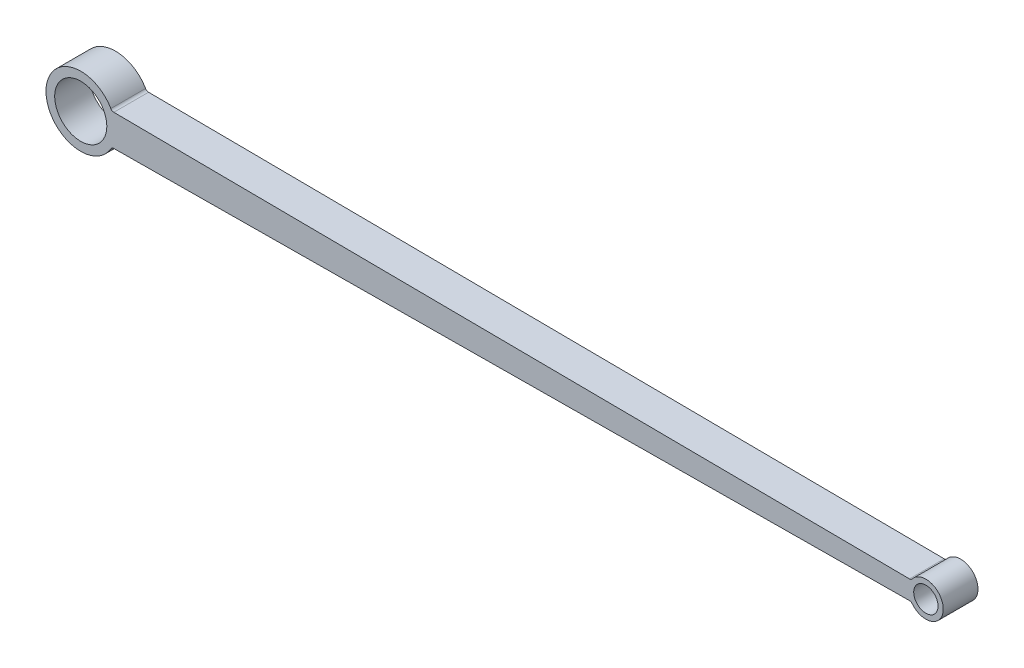
ISO-10303-21;
HEADER;
FILE_DESCRIPTION(('STEP AP214'),'2;1');
FILE_NAME('part.step','',(''),(''),'','','');
FILE_SCHEMA(('AUTOMOTIVE_DESIGN { 1 0 10303 214 1 1 1 1 }'));
ENDSEC;
DATA;
#1=APPLICATION_CONTEXT('core data for automotive mechanical design processes');
#2=APPLICATION_PROTOCOL_DEFINITION('international standard','automotive_design',2000,#1);
#3=PRODUCT_CONTEXT('',#1,'mechanical');
#4=PRODUCT('Part','Part','',(#3));
#5=PRODUCT_RELATED_PRODUCT_CATEGORY('part','',(#4));
#6=PRODUCT_DEFINITION_FORMATION('','',#4);
#7=PRODUCT_DEFINITION_CONTEXT('part definition',#1,'design');
#8=PRODUCT_DEFINITION('design','',#6,#7);
#9=PRODUCT_DEFINITION_SHAPE('','',#8);
#10=(LENGTH_UNIT() NAMED_UNIT(*) SI_UNIT(.MILLI.,.METRE.));
#11=(NAMED_UNIT(*) PLANE_ANGLE_UNIT() SI_UNIT($,.RADIAN.));
#12=(NAMED_UNIT(*) SI_UNIT($,.STERADIAN.) SOLID_ANGLE_UNIT());
#13=UNCERTAINTY_MEASURE_WITH_UNIT(LENGTH_MEASURE(1.E-05),#10,'distance_accuracy_value','');
#14=(GEOMETRIC_REPRESENTATION_CONTEXT(3) GLOBAL_UNCERTAINTY_ASSIGNED_CONTEXT((#13)) GLOBAL_UNIT_ASSIGNED_CONTEXT((#10,
#11,#12)) REPRESENTATION_CONTEXT('',''));
#15=CARTESIAN_POINT('',(0.,0.,0.));
#16=DIRECTION('',(0.,0.,1.));
#17=DIRECTION('',(1.,0.,0.));
#18=AXIS2_PLACEMENT_3D('',#15,#16,#17);
#19=CARTESIAN_POINT('',(238.480970882939,3.70550457999018,10.));
#20=DIRECTION('',(0.,0.,1.));
#21=DIRECTION('',(1.,0.,0.));
#22=AXIS2_PLACEMENT_3D('',#19,#20,#21);
#23=PLANE('',#22);
#24=CARTESIAN_POINT('',(0.,0.,10.));
#25=DIRECTION('',(0.,0.,1.));
#26=DIRECTION('',(1.,0.,0.));
#27=AXIS2_PLACEMENT_3D('',#24,#25,#26);
#28=CIRCLE('',#27,7.5);
#29=CARTESIAN_POINT('',(7.5,0.,10.));
#30=VERTEX_POINT('',#29);
#31=EDGE_CURVE('E133',#30,#30,#28,.T.);
#32=ORIENTED_EDGE('',*,*,#31,.F.);
#33=EDGE_LOOP('',(#32));
#34=FACE_BOUND('',#33,.T.);
#35=CARTESIAN_POINT('',(238.480970882939,3.70550457999018,10.));
#36=DIRECTION('',(0.,0.,-1.));
#37=DIRECTION('',(1.,0.,0.));
#38=AXIS2_PLACEMENT_3D('',#35,#36,#37);
#39=CIRCLE('',#38,0.999999999999998);
#40=CARTESIAN_POINT('',(239.267475735782,3.08792048332516,10.));
#41=VERTEX_POINT('',#40);
#42=CARTESIAN_POINT('',(238.473101756803,2.70553554204258,10.));
#43=VERTEX_POINT('',#42);
#44=EDGE_CURVE('E144',#41,#43,#39,.T.);
#45=ORIENTED_EDGE('',*,*,#44,.T.);
#46=DIRECTION('',(-0.999969037947602,0.00786912613617369,0.));
#47=VECTOR('',#46,1.);
#48=CARTESIAN_POINT('',(9.51421115466079,4.50729771844414,10.));
#49=LINE('',#48,#47);
#50=CARTESIAN_POINT('',(9.51421115466079,4.50729771844414,10.));
#51=VERTEX_POINT('',#50);
#52=EDGE_CURVE('E92',#43,#51,#49,.T.);
#53=ORIENTED_EDGE('',*,*,#52,.T.);
#54=CARTESIAN_POINT('',(9.52208028079696,5.50726675639174,10.));
#55=DIRECTION('',(0.,0.,-1.));
#56=DIRECTION('',(-1.,0.,0.));
#57=AXIS2_PLACEMENT_3D('',#54,#55,#56);
#58=CIRCLE('',#57,0.999999999999999);
#59=CARTESIAN_POINT('',(8.65643661890633,5.00660614217431,10.));
#60=VERTEX_POINT('',#59);
#61=EDGE_CURVE('E159',#51,#60,#58,.T.);
#62=ORIENTED_EDGE('',*,*,#61,.T.);
#63=CARTESIAN_POINT('',(0.,0.,10.));
#64=DIRECTION('',(0.,0.,1.));
#65=DIRECTION('',(1.,0.,0.));
#66=AXIS2_PLACEMENT_3D('',#63,#64,#65);
#67=CIRCLE('',#66,10.);
#68=CARTESIAN_POINT('',(8.65643661890633,-5.00660614217431,10.));
#69=VERTEX_POINT('',#68);
#70=EDGE_CURVE('E172',#60,#69,#67,.T.);
#71=ORIENTED_EDGE('',*,*,#70,.T.);
#72=CARTESIAN_POINT('',(9.52208028079696,-5.50726675639174,10.));
#73=DIRECTION('',(0.,0.,-1.));
#74=DIRECTION('',(1.,0.,0.));
#75=AXIS2_PLACEMENT_3D('',#72,#73,#74);
#76=CIRCLE('',#75,0.999999999999999);
#77=CARTESIAN_POINT('',(9.51421115466079,-4.50729771844414,10.));
#78=VERTEX_POINT('',#77);
#79=EDGE_CURVE('E111',#69,#78,#76,.T.);
#80=ORIENTED_EDGE('',*,*,#79,.T.);
#81=DIRECTION('',(0.999969037947602,0.00786912613617369,0.));
#82=VECTOR('',#81,1.);
#83=CARTESIAN_POINT('',(9.51421115466079,-4.50729771844414,10.));
#84=LINE('',#83,#82);
#85=CARTESIAN_POINT('',(238.473101756803,-2.70553554204258,10.));
#86=VERTEX_POINT('',#85);
#87=EDGE_CURVE('E105',#78,#86,#84,.T.);
#88=ORIENTED_EDGE('',*,*,#87,.T.);
#89=CARTESIAN_POINT('',(238.480970882939,-3.70550457999018,10.));
#90=DIRECTION('',(0.,0.,-1.));
#91=DIRECTION('',(-1.,0.,0.));
#92=AXIS2_PLACEMENT_3D('',#89,#90,#91);
#93=CIRCLE('',#92,0.999999999999998);
#94=CARTESIAN_POINT('',(239.267475735782,-3.08792048332516,10.));
#95=VERTEX_POINT('',#94);
#96=EDGE_CURVE('E109',#86,#95,#93,.T.);
#97=ORIENTED_EDGE('',*,*,#96,.T.);
#98=CARTESIAN_POINT('',(243.2,0.,10.));
#99=DIRECTION('',(0.,0.,1.));
#100=DIRECTION('',(1.,0.,0.));
#101=AXIS2_PLACEMENT_3D('',#98,#99,#100);
#102=CIRCLE('',#101,5.00000000000002);
#103=EDGE_CURVE('E49',#95,#41,#102,.T.);
#104=ORIENTED_EDGE('',*,*,#103,.T.);
#105=EDGE_LOOP('',(#45,#53,#62,#71,#80,#88,#97,#104));
#106=FACE_BOUND('',#105,.T.);
#107=CARTESIAN_POINT('',(243.2,0.,10.));
#108=DIRECTION('',(0.,0.,1.));
#109=DIRECTION('',(1.,0.,0.));
#110=AXIS2_PLACEMENT_3D('',#107,#108,#109);
#111=CIRCLE('',#110,3.49999999999999);
#112=CARTESIAN_POINT('',(246.7,0.,10.));
#113=VERTEX_POINT('',#112);
#114=EDGE_CURVE('E181',#113,#113,#111,.T.);
#115=ORIENTED_EDGE('',*,*,#114,.F.);
#116=EDGE_LOOP('',(#115));
#117=FACE_BOUND('',#116,.T.);
#118=ADVANCED_FACE('F32',(#34,#106,#117),#23,.T.);
#119=CARTESIAN_POINT('',(238.480970882939,3.70550457999018,0.));
#120=DIRECTION('',(0.,0.,1.));
#121=DIRECTION('',(1.,0.,0.));
#122=AXIS2_PLACEMENT_3D('',#119,#120,#121);
#123=PLANE('',#122);
#124=CARTESIAN_POINT('',(238.480970882939,3.70550457999018,0.));
#125=DIRECTION('',(0.,0.,-1.));
#126=DIRECTION('',(1.,0.,0.));
#127=AXIS2_PLACEMENT_3D('',#124,#125,#126);
#128=CIRCLE('',#127,0.999999999999998);
#129=CARTESIAN_POINT('',(239.267475735782,3.08792048332516,0.));
#130=VERTEX_POINT('',#129);
#131=CARTESIAN_POINT('',(238.473101756803,2.70553554204258,0.));
#132=VERTEX_POINT('',#131);
#133=EDGE_CURVE('E129',#130,#132,#128,.T.);
#134=ORIENTED_EDGE('',*,*,#133,.F.);
#135=CARTESIAN_POINT('',(243.2,0.,0.));
#136=DIRECTION('',(0.,0.,1.));
#137=DIRECTION('',(1.,0.,0.));
#138=AXIS2_PLACEMENT_3D('',#135,#136,#137);
#139=CIRCLE('',#138,5.00000000000002);
#140=CARTESIAN_POINT('',(239.267475735782,-3.08792048332516,0.));
#141=VERTEX_POINT('',#140);
#142=EDGE_CURVE('E84',#141,#130,#139,.T.);
#143=ORIENTED_EDGE('',*,*,#142,.F.);
#144=CARTESIAN_POINT('',(238.480970882939,-3.70550457999018,0.));
#145=DIRECTION('',(0.,0.,-1.));
#146=DIRECTION('',(-1.,0.,0.));
#147=AXIS2_PLACEMENT_3D('',#144,#145,#146);
#148=CIRCLE('',#147,0.999999999999998);
#149=CARTESIAN_POINT('',(238.473101756803,-2.70553554204258,0.));
#150=VERTEX_POINT('',#149);
#151=EDGE_CURVE('E78',#150,#141,#148,.T.);
#152=ORIENTED_EDGE('',*,*,#151,.F.);
#153=DIRECTION('',(0.999969037947602,0.00786912613617369,0.));
#154=VECTOR('',#153,1.);
#155=CARTESIAN_POINT('',(9.51421115466079,-4.50729771844414,0.));
#156=LINE('',#155,#154);
#157=CARTESIAN_POINT('',(9.51421115466079,-4.50729771844414,0.));
#158=VERTEX_POINT('',#157);
#159=EDGE_CURVE('E119',#158,#150,#156,.T.);
#160=ORIENTED_EDGE('',*,*,#159,.F.);
#161=CARTESIAN_POINT('',(9.52208028079696,-5.50726675639174,0.));
#162=DIRECTION('',(0.,0.,-1.));
#163=DIRECTION('',(1.,0.,0.));
#164=AXIS2_PLACEMENT_3D('',#161,#162,#163);
#165=CIRCLE('',#164,0.999999999999999);
#166=CARTESIAN_POINT('',(8.65643661890633,-5.00660614217431,0.));
#167=VERTEX_POINT('',#166);
#168=EDGE_CURVE('E139',#167,#158,#165,.T.);
#169=ORIENTED_EDGE('',*,*,#168,.F.);
#170=CARTESIAN_POINT('',(0.,0.,0.));
#171=DIRECTION('',(0.,0.,1.));
#172=DIRECTION('',(1.,0.,0.));
#173=AXIS2_PLACEMENT_3D('',#170,#171,#172);
#174=CIRCLE('',#173,10.);
#175=CARTESIAN_POINT('',(8.65643661890633,5.00660614217431,0.));
#176=VERTEX_POINT('',#175);
#177=EDGE_CURVE('E137',#176,#167,#174,.T.);
#178=ORIENTED_EDGE('',*,*,#177,.F.);
#179=CARTESIAN_POINT('',(9.52208028079696,5.50726675639174,0.));
#180=DIRECTION('',(0.,0.,-1.));
#181=DIRECTION('',(-1.,0.,0.));
#182=AXIS2_PLACEMENT_3D('',#179,#180,#181);
#183=CIRCLE('',#182,0.999999999999999);
#184=CARTESIAN_POINT('',(9.51421115466079,4.50729771844414,0.));
#185=VERTEX_POINT('',#184);
#186=EDGE_CURVE('E135',#185,#176,#183,.T.);
#187=ORIENTED_EDGE('',*,*,#186,.F.);
#188=DIRECTION('',(-0.999969037947602,0.00786912613617369,0.));
#189=VECTOR('',#188,1.);
#190=CARTESIAN_POINT('',(9.51421115466079,4.50729771844414,0.));
#191=LINE('',#190,#189);
#192=EDGE_CURVE('E132',#132,#185,#191,.T.);
#193=ORIENTED_EDGE('',*,*,#192,.F.);
#194=EDGE_LOOP('',(#134,#143,#152,#160,#169,#178,#187,#193));
#195=FACE_BOUND('',#194,.T.);
#196=CARTESIAN_POINT('',(0.,0.,0.));
#197=DIRECTION('',(0.,0.,1.));
#198=DIRECTION('',(1.,0.,0.));
#199=AXIS2_PLACEMENT_3D('',#196,#197,#198);
#200=CIRCLE('',#199,7.5);
#201=CARTESIAN_POINT('',(7.5,0.,0.));
#202=VERTEX_POINT('',#201);
#203=EDGE_CURVE('E178',#202,#202,#200,.T.);
#204=ORIENTED_EDGE('',*,*,#203,.T.);
#205=EDGE_LOOP('',(#204));
#206=FACE_BOUND('',#205,.T.);
#207=CARTESIAN_POINT('',(243.2,0.,0.));
#208=DIRECTION('',(0.,0.,1.));
#209=DIRECTION('',(1.,0.,0.));
#210=AXIS2_PLACEMENT_3D('',#207,#208,#209);
#211=CIRCLE('',#210,3.49999999999999);
#212=CARTESIAN_POINT('',(246.7,0.,0.));
#213=VERTEX_POINT('',#212);
#214=EDGE_CURVE('E184',#213,#213,#211,.T.);
#215=ORIENTED_EDGE('',*,*,#214,.T.);
#216=EDGE_LOOP('',(#215));
#217=FACE_BOUND('',#216,.T.);
#218=ADVANCED_FACE('F163',(#195,#206,#217),#123,.F.);
#219=CARTESIAN_POINT('',(238.480970882939,3.70550457999018,10.));
#220=DIRECTION('',(0.,0.,-1.));
#221=DIRECTION('',(-1.,0.,0.));
#222=AXIS2_PLACEMENT_3D('',#219,#220,#221);
#223=CYLINDRICAL_SURFACE('',#222,0.999999999999998);
#224=ORIENTED_EDGE('',*,*,#133,.T.);
#225=DIRECTION('',(0.,0.,-1.));
#226=VECTOR('',#225,1.);
#227=CARTESIAN_POINT('',(238.473101756803,2.70553554204258,10.));
#228=LINE('',#227,#226);
#229=EDGE_CURVE('E11',#43,#132,#228,.T.);
#230=ORIENTED_EDGE('',*,*,#229,.F.);
#231=ORIENTED_EDGE('',*,*,#44,.F.);
#232=DIRECTION('',(0.,0.,-1.));
#233=VECTOR('',#232,1.);
#234=CARTESIAN_POINT('',(239.267475735782,3.08792048332516,10.));
#235=LINE('',#234,#233);
#236=EDGE_CURVE('E125',#41,#130,#235,.T.);
#237=ORIENTED_EDGE('',*,*,#236,.T.);
#238=EDGE_LOOP('',(#224,#230,#231,#237));
#239=FACE_BOUND('',#238,.T.);
#240=ADVANCED_FACE('F34',(#239),#223,.F.);
#241=CARTESIAN_POINT('',(9.51421115466079,4.50729771844414,10.));
#242=DIRECTION('',(-0.00786912613617369,-0.999969037947602,0.));
#243=DIRECTION('',(0.999969037947602,-0.00786912613617369,0.));
#244=AXIS2_PLACEMENT_3D('',#241,#242,#243);
#245=PLANE('',#244);
#246=ORIENTED_EDGE('',*,*,#192,.T.);
#247=DIRECTION('',(0.,0.,-1.));
#248=VECTOR('',#247,1.);
#249=CARTESIAN_POINT('',(9.51421115466079,4.50729771844414,10.));
#250=LINE('',#249,#248);
#251=EDGE_CURVE('E41',#51,#185,#250,.T.);
#252=ORIENTED_EDGE('',*,*,#251,.F.);
#253=ORIENTED_EDGE('',*,*,#52,.F.);
#254=ORIENTED_EDGE('',*,*,#229,.T.);
#255=EDGE_LOOP('',(#246,#252,#253,#254));
#256=FACE_BOUND('',#255,.T.);
#257=ADVANCED_FACE('F216',(#256),#245,.F.);
#258=CARTESIAN_POINT('',(9.52208028079696,5.50726675639174,10.));
#259=DIRECTION('',(0.,0.,-1.));
#260=DIRECTION('',(-1.,0.,0.));
#261=AXIS2_PLACEMENT_3D('',#258,#259,#260);
#262=CYLINDRICAL_SURFACE('',#261,0.999999999999999);
#263=ORIENTED_EDGE('',*,*,#186,.T.);
#264=DIRECTION('',(0.,0.,-1.));
#265=VECTOR('',#264,1.);
#266=CARTESIAN_POINT('',(8.65643661890633,5.00660614217431,10.));
#267=LINE('',#266,#265);
#268=EDGE_CURVE('E151',#60,#176,#267,.T.);
#269=ORIENTED_EDGE('',*,*,#268,.F.);
#270=ORIENTED_EDGE('',*,*,#61,.F.);
#271=ORIENTED_EDGE('',*,*,#251,.T.);
#272=EDGE_LOOP('',(#263,#269,#270,#271));
#273=FACE_BOUND('',#272,.T.);
#274=ADVANCED_FACE('F157',(#273),#262,.F.);
#275=CARTESIAN_POINT('',(0.,0.,10.));
#276=DIRECTION('',(0.,0.,-1.));
#277=DIRECTION('',(-1.,0.,0.));
#278=AXIS2_PLACEMENT_3D('',#275,#276,#277);
#279=CYLINDRICAL_SURFACE('',#278,10.);
#280=ORIENTED_EDGE('',*,*,#177,.T.);
#281=DIRECTION('',(0.,0.,-1.));
#282=VECTOR('',#281,1.);
#283=CARTESIAN_POINT('',(8.65643661890633,-5.00660614217431,10.));
#284=LINE('',#283,#282);
#285=EDGE_CURVE('E148',#69,#167,#284,.T.);
#286=ORIENTED_EDGE('',*,*,#285,.F.);
#287=ORIENTED_EDGE('',*,*,#70,.F.);
#288=ORIENTED_EDGE('',*,*,#268,.T.);
#289=EDGE_LOOP('',(#280,#286,#287,#288));
#290=FACE_BOUND('',#289,.T.);
#291=ADVANCED_FACE('F168',(#290),#279,.T.);
#292=CARTESIAN_POINT('',(9.52208028079696,-5.50726675639174,10.));
#293=DIRECTION('',(0.,0.,-1.));
#294=DIRECTION('',(-1.,0.,0.));
#295=AXIS2_PLACEMENT_3D('',#292,#293,#294);
#296=CYLINDRICAL_SURFACE('',#295,0.999999999999999);
#297=ORIENTED_EDGE('',*,*,#168,.T.);
#298=DIRECTION('',(0.,0.,-1.));
#299=VECTOR('',#298,1.);
#300=CARTESIAN_POINT('',(9.51421115466079,-4.50729771844414,10.));
#301=LINE('',#300,#299);
#302=EDGE_CURVE('E120',#78,#158,#301,.T.);
#303=ORIENTED_EDGE('',*,*,#302,.F.);
#304=ORIENTED_EDGE('',*,*,#79,.F.);
#305=ORIENTED_EDGE('',*,*,#285,.T.);
#306=EDGE_LOOP('',(#297,#303,#304,#305));
#307=FACE_BOUND('',#306,.T.);
#308=ADVANCED_FACE('F171',(#307),#296,.F.);
#309=CARTESIAN_POINT('',(9.51421115466079,-4.50729771844414,10.));
#310=DIRECTION('',(-0.00786912613617369,0.999969037947602,0.));
#311=DIRECTION('',(-0.999969037947602,-0.00786912613617369,0.));
#312=AXIS2_PLACEMENT_3D('',#309,#310,#311);
#313=PLANE('',#312);
#314=ORIENTED_EDGE('',*,*,#159,.T.);
#315=DIRECTION('',(0.,0.,-1.));
#316=VECTOR('',#315,1.);
#317=CARTESIAN_POINT('',(238.473101756803,-2.70553554204258,10.));
#318=LINE('',#317,#316);
#319=EDGE_CURVE('E116',#86,#150,#318,.T.);
#320=ORIENTED_EDGE('',*,*,#319,.F.);
#321=ORIENTED_EDGE('',*,*,#87,.F.);
#322=ORIENTED_EDGE('',*,*,#302,.T.);
#323=EDGE_LOOP('',(#314,#320,#321,#322));
#324=FACE_BOUND('',#323,.T.);
#325=ADVANCED_FACE('F117',(#324),#313,.F.);
#326=CARTESIAN_POINT('',(238.480970882939,-3.70550457999018,10.));
#327=DIRECTION('',(0.,0.,-1.));
#328=DIRECTION('',(-1.,0.,0.));
#329=AXIS2_PLACEMENT_3D('',#326,#327,#328);
#330=CYLINDRICAL_SURFACE('',#329,0.999999999999998);
#331=ORIENTED_EDGE('',*,*,#151,.T.);
#332=DIRECTION('',(0.,0.,-1.));
#333=VECTOR('',#332,1.);
#334=CARTESIAN_POINT('',(239.267475735782,-3.08792048332516,10.));
#335=LINE('',#334,#333);
#336=EDGE_CURVE('E121',#95,#141,#335,.T.);
#337=ORIENTED_EDGE('',*,*,#336,.F.);
#338=ORIENTED_EDGE('',*,*,#96,.F.);
#339=ORIENTED_EDGE('',*,*,#319,.T.);
#340=EDGE_LOOP('',(#331,#337,#338,#339));
#341=FACE_BOUND('',#340,.T.);
#342=ADVANCED_FACE('F123',(#341),#330,.F.);
#343=CARTESIAN_POINT('',(243.2,0.,10.));
#344=DIRECTION('',(0.,0.,-1.));
#345=DIRECTION('',(-1.,0.,0.));
#346=AXIS2_PLACEMENT_3D('',#343,#344,#345);
#347=CYLINDRICAL_SURFACE('',#346,5.00000000000002);
#348=ORIENTED_EDGE('',*,*,#142,.T.);
#349=ORIENTED_EDGE('',*,*,#236,.F.);
#350=ORIENTED_EDGE('',*,*,#103,.F.);
#351=ORIENTED_EDGE('',*,*,#336,.T.);
#352=EDGE_LOOP('',(#348,#349,#350,#351));
#353=FACE_BOUND('',#352,.T.);
#354=ADVANCED_FACE('F204',(#353),#347,.T.);
#355=CARTESIAN_POINT('',(0.,0.,10.));
#356=DIRECTION('',(0.,0.,-1.));
#357=DIRECTION('',(-1.,0.,0.));
#358=AXIS2_PLACEMENT_3D('',#355,#356,#357);
#359=CYLINDRICAL_SURFACE('',#358,7.5);
#360=ORIENTED_EDGE('',*,*,#31,.T.);
#361=EDGE_LOOP('',(#360));
#362=FACE_BOUND('',#361,.T.);
#363=ORIENTED_EDGE('',*,*,#203,.F.);
#364=EDGE_LOOP('',(#363));
#365=FACE_BOUND('',#364,.T.);
#366=ADVANCED_FACE('F201',(#362,#365),#359,.F.);
#367=CARTESIAN_POINT('',(243.2,0.,10.));
#368=DIRECTION('',(0.,0.,-1.));
#369=DIRECTION('',(-1.,0.,0.));
#370=AXIS2_PLACEMENT_3D('',#367,#368,#369);
#371=CYLINDRICAL_SURFACE('',#370,3.49999999999999);
#372=ORIENTED_EDGE('',*,*,#114,.T.);
#373=EDGE_LOOP('',(#372));
#374=FACE_BOUND('',#373,.T.);
#375=ORIENTED_EDGE('',*,*,#214,.F.);
#376=EDGE_LOOP('',(#375));
#377=FACE_BOUND('',#376,.T.);
#378=ADVANCED_FACE('F190',(#374,#377),#371,.F.);
#379=CLOSED_SHELL('',(#118,#218,#240,#257,#274,#291,#308,#325,#342,#354,#366,#378));
#380=MANIFOLD_SOLID_BREP('B2',#379);
#381=ADVANCED_BREP_SHAPE_REPRESENTATION('',(#18,#380),#14);
#382=SHAPE_DEFINITION_REPRESENTATION(#9,#381);
ENDSEC;
END-ISO-10303-21;
